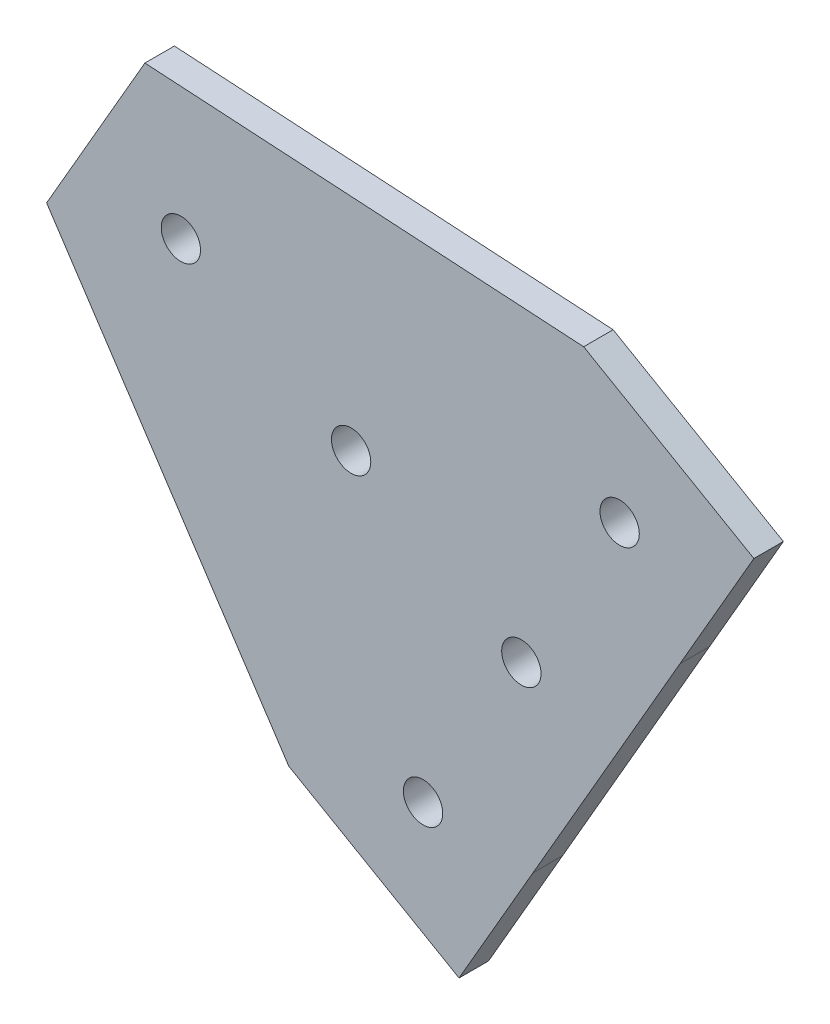
ISO-10303-21;
HEADER;
FILE_DESCRIPTION(('STEP AP214'),'2;1');
FILE_NAME('part.step','',(''),(''),'','','');
FILE_SCHEMA(('AUTOMOTIVE_DESIGN { 1 0 10303 214 1 1 1 1 }'));
ENDSEC;
DATA;
#1=APPLICATION_CONTEXT('core data for automotive mechanical design processes');
#2=APPLICATION_PROTOCOL_DEFINITION('international standard','automotive_design',2000,#1);
#3=PRODUCT_CONTEXT('',#1,'mechanical');
#4=PRODUCT('Part','Part','',(#3));
#5=PRODUCT_RELATED_PRODUCT_CATEGORY('part','',(#4));
#6=PRODUCT_DEFINITION_FORMATION('','',#4);
#7=PRODUCT_DEFINITION_CONTEXT('part definition',#1,'design');
#8=PRODUCT_DEFINITION('design','',#6,#7);
#9=PRODUCT_DEFINITION_SHAPE('','',#8);
#10=(LENGTH_UNIT() NAMED_UNIT(*) SI_UNIT(.MILLI.,.METRE.));
#11=(NAMED_UNIT(*) PLANE_ANGLE_UNIT() SI_UNIT($,.RADIAN.));
#12=(NAMED_UNIT(*) SI_UNIT($,.STERADIAN.) SOLID_ANGLE_UNIT());
#13=UNCERTAINTY_MEASURE_WITH_UNIT(LENGTH_MEASURE(1.E-05),#10,'distance_accuracy_value','');
#14=(GEOMETRIC_REPRESENTATION_CONTEXT(3) GLOBAL_UNCERTAINTY_ASSIGNED_CONTEXT((#13)) GLOBAL_UNIT_ASSIGNED_CONTEXT((#10,
#11,#12)) REPRESENTATION_CONTEXT('',''));
#15=CARTESIAN_POINT('',(0.,0.,0.));
#16=DIRECTION('',(0.,0.,1.));
#17=DIRECTION('',(1.,0.,0.));
#18=AXIS2_PLACEMENT_3D('',#15,#16,#17);
#19=CARTESIAN_POINT('',(18.546417841305,-9.55966834000055,3.));
#20=DIRECTION('',(0.,0.,1.));
#21=DIRECTION('',(1.,0.,0.));
#22=AXIS2_PLACEMENT_3D('',#19,#20,#21);
#23=PLANE('',#22);
#24=CARTESIAN_POINT('',(23.0560367845379,28.2512207924548,3.));
#25=DIRECTION('',(0.,0.,1.));
#26=DIRECTION('',(1.,0.,0.));
#27=AXIS2_PLACEMENT_3D('',#24,#25,#26);
#28=CIRCLE('',#27,2.);
#29=CARTESIAN_POINT('',(25.0560367845379,28.2512207924548,3.));
#30=VERTEX_POINT('',#29);
#31=EDGE_CURVE('E271',#30,#30,#28,.T.);
#32=ORIENTED_EDGE('',*,*,#31,.F.);
#33=EDGE_LOOP('',(#32));
#34=FACE_BOUND('',#33,.T.);
#35=CARTESIAN_POINT('',(3.05603678453836,-6.38979535892303,3.));
#36=DIRECTION('',(0.,0.,1.));
#37=DIRECTION('',(1.,0.,0.));
#38=AXIS2_PLACEMENT_3D('',#35,#36,#37);
#39=CIRCLE('',#38,2.);
#40=CARTESIAN_POINT('',(5.05603678453836,-6.38979535892303,3.));
#41=VERTEX_POINT('',#40);
#42=EDGE_CURVE('E255',#41,#41,#39,.T.);
#43=ORIENTED_EDGE('',*,*,#42,.F.);
#44=EDGE_LOOP('',(#43));
#45=FACE_BOUND('',#44,.T.);
#46=CARTESIAN_POINT('',(18.546417841305,-9.55966834000055,3.));
#47=DIRECTION('',(0.,0.,-1.));
#48=DIRECTION('',(1.,0.,0.));
#49=AXIS2_PLACEMENT_3D('',#46,#47,#48);
#50=CIRCLE('',#49,5.00000000000003);
#51=CARTESIAN_POINT('',(14.2162908223827,-7.0596683400006,3.));
#52=VERTEX_POINT('',#51);
#53=CARTESIAN_POINT('',(14.2635690539358,-6.97951209191583,3.));
#54=VERTEX_POINT('',#53);
#55=EDGE_CURVE('E188',#52,#54,#50,.T.);
#56=ORIENTED_EDGE('',*,*,#55,.T.);
#57=DIRECTION('',(0.500000000000001,0.866025403784438,0.));
#58=VECTOR('',#57,1.);
#59=CARTESIAN_POINT('',(14.2635690539358,-6.97951209191583,3.));
#60=LINE('',#59,#58);
#61=CARTESIAN_POINT('',(29.1705125910356,18.8400714999014,3.));
#62=VERTEX_POINT('',#61);
#63=EDGE_CURVE('E112',#54,#62,#60,.T.);
#64=ORIENTED_EDGE('',*,*,#63,.T.);
#65=CARTESIAN_POINT('',(33.5464178413046,16.4210937735327,3.));
#66=DIRECTION('',(0.,0.,-1.));
#67=DIRECTION('',(1.,0.,0.));
#68=AXIS2_PLACEMENT_3D('',#65,#66,#67);
#69=CIRCLE('',#68,4.99999999999999);
#70=CARTESIAN_POINT('',(29.2162908223824,18.9210937735327,3.));
#71=VERTEX_POINT('',#70);
#72=EDGE_CURVE('E217',#62,#71,#69,.T.);
#73=ORIENTED_EDGE('',*,*,#72,.T.);
#74=DIRECTION('',(0.499999999999984,0.866025403784448,0.));
#75=VECTOR('',#74,1.);
#76=CARTESIAN_POINT('',(29.2162908223824,18.9210937735327,3.));
#77=LINE('',#76,#75);
#78=CARTESIAN_POINT('',(36.7162908223822,31.9114748302994,3.));
#79=VERTEX_POINT('',#78);
#80=EDGE_CURVE('E237',#71,#79,#77,.T.);
#81=ORIENTED_EDGE('',*,*,#80,.T.);
#82=DIRECTION('',(-0.866025403784447,0.499999999999985,0.));
#83=VECTOR('',#82,1.);
#84=CARTESIAN_POINT('',(36.7162908223822,31.9114748302994,3.));
#85=LINE('',#84,#83);
#86=CARTESIAN_POINT('',(19.3957827466933,41.9114748302991,3.));
#87=VERTEX_POINT('',#86);
#88=EDGE_CURVE('E233',#79,#87,#85,.T.);
#89=ORIENTED_EDGE('',*,*,#88,.T.);
#90=DIRECTION('',(-0.998203466991463,0.0599152608792024,0.));
#91=VECTOR('',#90,1.);
#92=CARTESIAN_POINT('',(19.3957827466933,41.9114748302991,3.));
#93=LINE('',#92,#91);
#94=CARTESIAN_POINT('',(-25.2452334046843,44.5909667546097,3.));
#95=VERTEX_POINT('',#94);
#96=EDGE_CURVE('E236',#87,#95,#93,.T.);
#97=ORIENTED_EDGE('',*,*,#96,.T.);
#98=DIRECTION('',(-0.49999999999999,-0.866025403784444,0.));
#99=VECTOR('',#98,1.);
#100=CARTESIAN_POINT('',(-25.2452334046843,44.5909667546097,3.));
#101=LINE('',#100,#99);
#102=CARTESIAN_POINT('',(-35.2452334046841,27.2704586789209,3.));
#103=VERTEX_POINT('',#102);
#104=EDGE_CURVE('E137',#95,#103,#101,.T.);
#105=ORIENTED_EDGE('',*,*,#104,.T.);
#106=DIRECTION('',(0.550989871491516,-0.834511930120692,0.));
#107=VECTOR('',#106,1.);
#108=CARTESIAN_POINT('',(-35.2452334046841,27.2704586789209,3.));
#109=LINE('',#108,#107);
#110=CARTESIAN_POINT('',(-10.604217253306,-10.0500493967676,3.));
#111=VERTEX_POINT('',#110);
#112=EDGE_CURVE('E131',#103,#111,#109,.T.);
#113=ORIENTED_EDGE('',*,*,#112,.T.);
#114=DIRECTION('',(0.866025403784445,-0.499999999999989,0.));
#115=VECTOR('',#114,1.);
#116=CARTESIAN_POINT('',(-10.604217253306,-10.0500493967676,3.));
#117=LINE('',#116,#115);
#118=CARTESIAN_POINT('',(6.71629082238295,-20.0500493967674,3.));
#119=VERTEX_POINT('',#118);
#120=EDGE_CURVE('E135',#111,#119,#117,.T.);
#121=ORIENTED_EDGE('',*,*,#120,.T.);
#122=DIRECTION('',(0.499999999999984,0.866025403784448,0.));
#123=VECTOR('',#122,1.);
#124=CARTESIAN_POINT('',(6.71629082238295,-20.0500493967674,3.));
#125=LINE('',#124,#123);
#126=EDGE_CURVE('E63',#119,#52,#125,.T.);
#127=ORIENTED_EDGE('',*,*,#126,.T.);
#128=EDGE_LOOP('',(#56,#64,#73,#81,#89,#97,#105,#113,#121,#127));
#129=FACE_BOUND('',#128,.T.);
#130=CARTESIAN_POINT('',(-21.5849793668397,30.9307127167654,3.));
#131=DIRECTION('',(0.,0.,1.));
#132=DIRECTION('',(1.,0.,0.));
#133=AXIS2_PLACEMENT_3D('',#130,#131,#132);
#134=CIRCLE('',#133,2.);
#135=CARTESIAN_POINT('',(-19.5849793668397,30.9307127167654,3.));
#136=VERTEX_POINT('',#135);
#137=EDGE_CURVE('E164',#136,#136,#134,.T.);
#138=ORIENTED_EDGE('',*,*,#137,.F.);
#139=EDGE_LOOP('',(#138));
#140=FACE_BOUND('',#139,.T.);
#141=CARTESIAN_POINT('',(13.0560367845381,10.9307127167659,3.));
#142=DIRECTION('',(0.,0.,1.));
#143=DIRECTION('',(1.,0.,0.));
#144=AXIS2_PLACEMENT_3D('',#141,#142,#143);
#145=CIRCLE('',#144,2.);
#146=CARTESIAN_POINT('',(15.0560367845381,10.9307127167659,3.));
#147=VERTEX_POINT('',#146);
#148=EDGE_CURVE('E263',#147,#147,#145,.T.);
#149=ORIENTED_EDGE('',*,*,#148,.F.);
#150=EDGE_LOOP('',(#149));
#151=FACE_BOUND('',#150,.T.);
#152=CARTESIAN_POINT('',(-4.26447129115082,20.9307127167657,3.));
#153=DIRECTION('',(0.,0.,1.));
#154=DIRECTION('',(1.,0.,0.));
#155=AXIS2_PLACEMENT_3D('',#152,#153,#154);
#156=CIRCLE('',#155,2.);
#157=CARTESIAN_POINT('',(-2.26447129115082,20.9307127167657,3.));
#158=VERTEX_POINT('',#157);
#159=EDGE_CURVE('E279',#158,#158,#156,.T.);
#160=ORIENTED_EDGE('',*,*,#159,.F.);
#161=EDGE_LOOP('',(#160));
#162=FACE_BOUND('',#161,.T.);
#163=ADVANCED_FACE('F45',(#34,#45,#129,#140,#151,#162),#23,.T.);
#164=CARTESIAN_POINT('',(18.546417841305,-9.55966834000055,0.));
#165=DIRECTION('',(0.,0.,1.));
#166=DIRECTION('',(1.,0.,0.));
#167=AXIS2_PLACEMENT_3D('',#164,#165,#166);
#168=PLANE('',#167);
#169=CARTESIAN_POINT('',(18.546417841305,-9.55966834000055,0.));
#170=DIRECTION('',(0.,0.,-1.));
#171=DIRECTION('',(1.,0.,0.));
#172=AXIS2_PLACEMENT_3D('',#169,#170,#171);
#173=CIRCLE('',#172,5.00000000000003);
#174=CARTESIAN_POINT('',(14.2162908223827,-7.0596683400006,0.));
#175=VERTEX_POINT('',#174);
#176=CARTESIAN_POINT('',(14.2635690539358,-6.97951209191583,0.));
#177=VERTEX_POINT('',#176);
#178=EDGE_CURVE('E159',#175,#177,#173,.T.);
#179=ORIENTED_EDGE('',*,*,#178,.F.);
#180=DIRECTION('',(0.499999999999984,0.866025403784448,0.));
#181=VECTOR('',#180,1.);
#182=CARTESIAN_POINT('',(6.71629082238295,-20.0500493967674,0.));
#183=LINE('',#182,#181);
#184=CARTESIAN_POINT('',(6.71629082238295,-20.0500493967674,0.));
#185=VERTEX_POINT('',#184);
#186=EDGE_CURVE('E104',#185,#175,#183,.T.);
#187=ORIENTED_EDGE('',*,*,#186,.F.);
#188=DIRECTION('',(0.866025403784445,-0.499999999999989,0.));
#189=VECTOR('',#188,1.);
#190=CARTESIAN_POINT('',(-10.604217253306,-10.0500493967676,0.));
#191=LINE('',#190,#189);
#192=CARTESIAN_POINT('',(-10.604217253306,-10.0500493967676,0.));
#193=VERTEX_POINT('',#192);
#194=EDGE_CURVE('E98',#193,#185,#191,.T.);
#195=ORIENTED_EDGE('',*,*,#194,.F.);
#196=DIRECTION('',(0.550989871491516,-0.834511930120692,0.));
#197=VECTOR('',#196,1.);
#198=CARTESIAN_POINT('',(-35.2452334046841,27.2704586789209,0.));
#199=LINE('',#198,#197);
#200=CARTESIAN_POINT('',(-35.2452334046841,27.2704586789209,0.));
#201=VERTEX_POINT('',#200);
#202=EDGE_CURVE('E146',#201,#193,#199,.T.);
#203=ORIENTED_EDGE('',*,*,#202,.F.);
#204=DIRECTION('',(-0.49999999999999,-0.866025403784444,0.));
#205=VECTOR('',#204,1.);
#206=CARTESIAN_POINT('',(-25.2452334046843,44.5909667546097,0.));
#207=LINE('',#206,#205);
#208=CARTESIAN_POINT('',(-25.2452334046843,44.5909667546097,0.));
#209=VERTEX_POINT('',#208);
#210=EDGE_CURVE('E179',#209,#201,#207,.T.);
#211=ORIENTED_EDGE('',*,*,#210,.F.);
#212=DIRECTION('',(-0.998203466991463,0.0599152608792024,0.));
#213=VECTOR('',#212,1.);
#214=CARTESIAN_POINT('',(19.3957827466933,41.9114748302991,0.));
#215=LINE('',#214,#213);
#216=CARTESIAN_POINT('',(19.3957827466933,41.9114748302991,0.));
#217=VERTEX_POINT('',#216);
#218=EDGE_CURVE('E176',#217,#209,#215,.T.);
#219=ORIENTED_EDGE('',*,*,#218,.F.);
#220=DIRECTION('',(-0.866025403784447,0.499999999999985,0.));
#221=VECTOR('',#220,1.);
#222=CARTESIAN_POINT('',(36.7162908223822,31.9114748302994,0.));
#223=LINE('',#222,#221);
#224=CARTESIAN_POINT('',(36.7162908223822,31.9114748302994,0.));
#225=VERTEX_POINT('',#224);
#226=EDGE_CURVE('E173',#225,#217,#223,.T.);
#227=ORIENTED_EDGE('',*,*,#226,.F.);
#228=DIRECTION('',(0.499999999999984,0.866025403784448,0.));
#229=VECTOR('',#228,1.);
#230=CARTESIAN_POINT('',(29.2162908223824,18.9210937735327,0.));
#231=LINE('',#230,#229);
#232=CARTESIAN_POINT('',(29.2162908223824,18.9210937735327,0.));
#233=VERTEX_POINT('',#232);
#234=EDGE_CURVE('E170',#233,#225,#231,.T.);
#235=ORIENTED_EDGE('',*,*,#234,.F.);
#236=CARTESIAN_POINT('',(33.5464178413046,16.4210937735327,0.));
#237=DIRECTION('',(0.,0.,-1.));
#238=DIRECTION('',(1.,0.,0.));
#239=AXIS2_PLACEMENT_3D('',#236,#237,#238);
#240=CIRCLE('',#239,4.99999999999999);
#241=CARTESIAN_POINT('',(29.1705125910356,18.8400714999014,0.));
#242=VERTEX_POINT('',#241);
#243=EDGE_CURVE('E167',#242,#233,#240,.T.);
#244=ORIENTED_EDGE('',*,*,#243,.F.);
#245=DIRECTION('',(0.500000000000001,0.866025403784438,0.));
#246=VECTOR('',#245,1.);
#247=CARTESIAN_POINT('',(14.2635690539358,-6.97951209191583,0.));
#248=LINE('',#247,#246);
#249=EDGE_CURVE('E163',#177,#242,#248,.T.);
#250=ORIENTED_EDGE('',*,*,#249,.F.);
#251=EDGE_LOOP('',(#179,#187,#195,#203,#211,#219,#227,#235,#244,#250));
#252=FACE_BOUND('',#251,.T.);
#253=CARTESIAN_POINT('',(-21.5849793668397,30.9307127167654,0.));
#254=DIRECTION('',(0.,0.,1.));
#255=DIRECTION('',(1.,0.,0.));
#256=AXIS2_PLACEMENT_3D('',#253,#254,#255);
#257=CIRCLE('',#256,2.);
#258=CARTESIAN_POINT('',(-19.5849793668397,30.9307127167654,0.));
#259=VERTEX_POINT('',#258);
#260=EDGE_CURVE('E251',#259,#259,#257,.T.);
#261=ORIENTED_EDGE('',*,*,#260,.T.);
#262=EDGE_LOOP('',(#261));
#263=FACE_BOUND('',#262,.T.);
#264=CARTESIAN_POINT('',(3.05603678453836,-6.38979535892303,0.));
#265=DIRECTION('',(0.,0.,1.));
#266=DIRECTION('',(1.,0.,0.));
#267=AXIS2_PLACEMENT_3D('',#264,#265,#266);
#268=CIRCLE('',#267,2.);
#269=CARTESIAN_POINT('',(5.05603678453836,-6.38979535892303,0.));
#270=VERTEX_POINT('',#269);
#271=EDGE_CURVE('E259',#270,#270,#268,.T.);
#272=ORIENTED_EDGE('',*,*,#271,.T.);
#273=EDGE_LOOP('',(#272));
#274=FACE_BOUND('',#273,.T.);
#275=CARTESIAN_POINT('',(13.0560367845381,10.9307127167659,0.));
#276=DIRECTION('',(0.,0.,1.));
#277=DIRECTION('',(1.,0.,0.));
#278=AXIS2_PLACEMENT_3D('',#275,#276,#277);
#279=CIRCLE('',#278,2.);
#280=CARTESIAN_POINT('',(15.0560367845381,10.9307127167659,0.));
#281=VERTEX_POINT('',#280);
#282=EDGE_CURVE('E267',#281,#281,#279,.T.);
#283=ORIENTED_EDGE('',*,*,#282,.T.);
#284=EDGE_LOOP('',(#283));
#285=FACE_BOUND('',#284,.T.);
#286=CARTESIAN_POINT('',(23.0560367845379,28.2512207924548,0.));
#287=DIRECTION('',(0.,0.,1.));
#288=DIRECTION('',(1.,0.,0.));
#289=AXIS2_PLACEMENT_3D('',#286,#287,#288);
#290=CIRCLE('',#289,2.);
#291=CARTESIAN_POINT('',(25.0560367845379,28.2512207924548,0.));
#292=VERTEX_POINT('',#291);
#293=EDGE_CURVE('E275',#292,#292,#290,.T.);
#294=ORIENTED_EDGE('',*,*,#293,.T.);
#295=EDGE_LOOP('',(#294));
#296=FACE_BOUND('',#295,.T.);
#297=CARTESIAN_POINT('',(-4.26447129115082,20.9307127167657,0.));
#298=DIRECTION('',(0.,0.,1.));
#299=DIRECTION('',(1.,0.,0.));
#300=AXIS2_PLACEMENT_3D('',#297,#298,#299);
#301=CIRCLE('',#300,2.);
#302=CARTESIAN_POINT('',(-2.26447129115082,20.9307127167657,0.));
#303=VERTEX_POINT('',#302);
#304=EDGE_CURVE('E283',#303,#303,#301,.T.);
#305=ORIENTED_EDGE('',*,*,#304,.T.);
#306=EDGE_LOOP('',(#305));
#307=FACE_BOUND('',#306,.T.);
#308=ADVANCED_FACE('F221',(#252,#263,#274,#285,#296,#307),#168,.F.);
#309=CARTESIAN_POINT('',(18.546417841305,-9.55966834000055,3.));
#310=DIRECTION('',(0.,0.,-1.));
#311=DIRECTION('',(-1.,0.,0.));
#312=AXIS2_PLACEMENT_3D('',#309,#310,#311);
#313=CYLINDRICAL_SURFACE('',#312,5.00000000000003);
#314=ORIENTED_EDGE('',*,*,#178,.T.);
#315=DIRECTION('',(0.,0.,-1.));
#316=VECTOR('',#315,1.);
#317=CARTESIAN_POINT('',(14.2635690539358,-6.97951209191583,3.));
#318=LINE('',#317,#316);
#319=EDGE_CURVE('E11',#54,#177,#318,.T.);
#320=ORIENTED_EDGE('',*,*,#319,.F.);
#321=ORIENTED_EDGE('',*,*,#55,.F.);
#322=DIRECTION('',(0.,0.,-1.));
#323=VECTOR('',#322,1.);
#324=CARTESIAN_POINT('',(14.2162908223827,-7.0596683400006,3.));
#325=LINE('',#324,#323);
#326=EDGE_CURVE('E155',#52,#175,#325,.T.);
#327=ORIENTED_EDGE('',*,*,#326,.T.);
#328=EDGE_LOOP('',(#314,#320,#321,#327));
#329=FACE_BOUND('',#328,.T.);
#330=ADVANCED_FACE('F47',(#329),#313,.F.);
#331=CARTESIAN_POINT('',(14.2635690539358,-6.97951209191583,3.));
#332=DIRECTION('',(-0.866025403784438,0.500000000000001,0.));
#333=DIRECTION('',(-0.500000000000001,-0.866025403784438,0.));
#334=AXIS2_PLACEMENT_3D('',#331,#332,#333);
#335=PLANE('',#334);
#336=ORIENTED_EDGE('',*,*,#249,.T.);
#337=DIRECTION('',(0.,0.,-1.));
#338=VECTOR('',#337,1.);
#339=CARTESIAN_POINT('',(29.1705125910356,18.8400714999014,3.));
#340=LINE('',#339,#338);
#341=EDGE_CURVE('E55',#62,#242,#340,.T.);
#342=ORIENTED_EDGE('',*,*,#341,.F.);
#343=ORIENTED_EDGE('',*,*,#63,.F.);
#344=ORIENTED_EDGE('',*,*,#319,.T.);
#345=EDGE_LOOP('',(#336,#342,#343,#344));
#346=FACE_BOUND('',#345,.T.);
#347=ADVANCED_FACE('F327',(#346),#335,.F.);
#348=CARTESIAN_POINT('',(33.5464178413046,16.4210937735327,3.));
#349=DIRECTION('',(0.,0.,-1.));
#350=DIRECTION('',(-1.,0.,0.));
#351=AXIS2_PLACEMENT_3D('',#348,#349,#350);
#352=CYLINDRICAL_SURFACE('',#351,4.99999999999999);
#353=ORIENTED_EDGE('',*,*,#243,.T.);
#354=DIRECTION('',(0.,0.,-1.));
#355=VECTOR('',#354,1.);
#356=CARTESIAN_POINT('',(29.2162908223824,18.9210937735327,3.));
#357=LINE('',#356,#355);
#358=EDGE_CURVE('E207',#71,#233,#357,.T.);
#359=ORIENTED_EDGE('',*,*,#358,.F.);
#360=ORIENTED_EDGE('',*,*,#72,.F.);
#361=ORIENTED_EDGE('',*,*,#341,.T.);
#362=EDGE_LOOP('',(#353,#359,#360,#361));
#363=FACE_BOUND('',#362,.T.);
#364=ADVANCED_FACE('F215',(#363),#352,.F.);
#365=CARTESIAN_POINT('',(29.2162908223824,18.9210937735327,3.));
#366=DIRECTION('',(-0.866025403784448,0.499999999999984,0.));
#367=DIRECTION('',(-0.499999999999984,-0.866025403784448,0.));
#368=AXIS2_PLACEMENT_3D('',#365,#366,#367);
#369=PLANE('',#368);
#370=ORIENTED_EDGE('',*,*,#234,.T.);
#371=DIRECTION('',(0.,0.,-1.));
#372=VECTOR('',#371,1.);
#373=CARTESIAN_POINT('',(36.7162908223822,31.9114748302994,3.));
#374=LINE('',#373,#372);
#375=EDGE_CURVE('E203',#79,#225,#374,.T.);
#376=ORIENTED_EDGE('',*,*,#375,.F.);
#377=ORIENTED_EDGE('',*,*,#80,.F.);
#378=ORIENTED_EDGE('',*,*,#358,.T.);
#379=EDGE_LOOP('',(#370,#376,#377,#378));
#380=FACE_BOUND('',#379,.T.);
#381=ADVANCED_FACE('F227',(#380),#369,.F.);
#382=CARTESIAN_POINT('',(36.7162908223822,31.9114748302994,3.));
#383=DIRECTION('',(-0.499999999999985,-0.866025403784447,0.));
#384=DIRECTION('',(0.866025403784448,-0.499999999999985,0.));
#385=AXIS2_PLACEMENT_3D('',#382,#383,#384);
#386=PLANE('',#385);
#387=ORIENTED_EDGE('',*,*,#226,.T.);
#388=DIRECTION('',(0.,0.,-1.));
#389=VECTOR('',#388,1.);
#390=CARTESIAN_POINT('',(19.3957827466933,41.9114748302991,3.));
#391=LINE('',#390,#389);
#392=EDGE_CURVE('E199',#87,#217,#391,.T.);
#393=ORIENTED_EDGE('',*,*,#392,.F.);
#394=ORIENTED_EDGE('',*,*,#88,.F.);
#395=ORIENTED_EDGE('',*,*,#375,.T.);
#396=EDGE_LOOP('',(#387,#393,#394,#395));
#397=FACE_BOUND('',#396,.T.);
#398=ADVANCED_FACE('F231',(#397),#386,.F.);
#399=CARTESIAN_POINT('',(19.3957827466933,41.9114748302991,3.));
#400=DIRECTION('',(-0.0599152608792024,-0.998203466991463,0.));
#401=DIRECTION('',(0.998203466991463,-0.0599152608792024,0.));
#402=AXIS2_PLACEMENT_3D('',#399,#400,#401);
#403=PLANE('',#402);
#404=ORIENTED_EDGE('',*,*,#218,.T.);
#405=DIRECTION('',(0.,0.,-1.));
#406=VECTOR('',#405,1.);
#407=CARTESIAN_POINT('',(-25.2452334046843,44.5909667546097,3.));
#408=LINE('',#407,#406);
#409=EDGE_CURVE('E195',#95,#209,#408,.T.);
#410=ORIENTED_EDGE('',*,*,#409,.F.);
#411=ORIENTED_EDGE('',*,*,#96,.F.);
#412=ORIENTED_EDGE('',*,*,#392,.T.);
#413=EDGE_LOOP('',(#404,#410,#411,#412));
#414=FACE_BOUND('',#413,.T.);
#415=ADVANCED_FACE('F317',(#414),#403,.F.);
#416=CARTESIAN_POINT('',(-25.2452334046843,44.5909667546097,3.));
#417=DIRECTION('',(0.866025403784444,-0.49999999999999,0.));
#418=DIRECTION('',(0.49999999999999,0.866025403784444,0.));
#419=AXIS2_PLACEMENT_3D('',#416,#417,#418);
#420=PLANE('',#419);
#421=ORIENTED_EDGE('',*,*,#210,.T.);
#422=DIRECTION('',(0.,0.,-1.));
#423=VECTOR('',#422,1.);
#424=CARTESIAN_POINT('',(-35.2452334046841,27.2704586789209,3.));
#425=LINE('',#424,#423);
#426=EDGE_CURVE('E148',#103,#201,#425,.T.);
#427=ORIENTED_EDGE('',*,*,#426,.F.);
#428=ORIENTED_EDGE('',*,*,#104,.F.);
#429=ORIENTED_EDGE('',*,*,#409,.T.);
#430=EDGE_LOOP('',(#421,#427,#428,#429));
#431=FACE_BOUND('',#430,.T.);
#432=ADVANCED_FACE('F314',(#431),#420,.F.);
#433=CARTESIAN_POINT('',(-35.2452334046841,27.2704586789209,3.));
#434=DIRECTION('',(0.834511930120691,0.550989871491516,0.));
#435=DIRECTION('',(-0.550989871491516,0.834511930120692,0.));
#436=AXIS2_PLACEMENT_3D('',#433,#434,#435);
#437=PLANE('',#436);
#438=ORIENTED_EDGE('',*,*,#202,.T.);
#439=DIRECTION('',(0.,0.,-1.));
#440=VECTOR('',#439,1.);
#441=CARTESIAN_POINT('',(-10.604217253306,-10.0500493967676,3.));
#442=LINE('',#441,#440);
#443=EDGE_CURVE('E143',#111,#193,#442,.T.);
#444=ORIENTED_EDGE('',*,*,#443,.F.);
#445=ORIENTED_EDGE('',*,*,#112,.F.);
#446=ORIENTED_EDGE('',*,*,#426,.T.);
#447=EDGE_LOOP('',(#438,#444,#445,#446));
#448=FACE_BOUND('',#447,.T.);
#449=ADVANCED_FACE('F144',(#448),#437,.F.);
#450=CARTESIAN_POINT('',(-10.604217253306,-10.0500493967676,3.));
#451=DIRECTION('',(0.499999999999989,0.866025403784445,0.));
#452=DIRECTION('',(-0.866025403784445,0.499999999999989,0.));
#453=AXIS2_PLACEMENT_3D('',#450,#451,#452);
#454=PLANE('',#453);
#455=ORIENTED_EDGE('',*,*,#194,.T.);
#456=DIRECTION('',(0.,0.,-1.));
#457=VECTOR('',#456,1.);
#458=CARTESIAN_POINT('',(6.71629082238295,-20.0500493967674,3.));
#459=LINE('',#458,#457);
#460=EDGE_CURVE('E149',#119,#185,#459,.T.);
#461=ORIENTED_EDGE('',*,*,#460,.F.);
#462=ORIENTED_EDGE('',*,*,#120,.F.);
#463=ORIENTED_EDGE('',*,*,#443,.T.);
#464=EDGE_LOOP('',(#455,#461,#462,#463));
#465=FACE_BOUND('',#464,.T.);
#466=ADVANCED_FACE('F151',(#465),#454,.F.);
#467=CARTESIAN_POINT('',(6.71629082238295,-20.0500493967674,3.));
#468=DIRECTION('',(-0.866025403784448,0.499999999999984,0.));
#469=DIRECTION('',(-0.499999999999984,-0.866025403784448,0.));
#470=AXIS2_PLACEMENT_3D('',#467,#468,#469);
#471=PLANE('',#470);
#472=ORIENTED_EDGE('',*,*,#186,.T.);
#473=ORIENTED_EDGE('',*,*,#326,.F.);
#474=ORIENTED_EDGE('',*,*,#126,.F.);
#475=ORIENTED_EDGE('',*,*,#460,.T.);
#476=EDGE_LOOP('',(#472,#473,#474,#475));
#477=FACE_BOUND('',#476,.T.);
#478=ADVANCED_FACE('F307',(#477),#471,.F.);
#479=CARTESIAN_POINT('',(-21.5849793668397,30.9307127167654,3.));
#480=DIRECTION('',(0.,0.,-1.));
#481=DIRECTION('',(-1.,0.,0.));
#482=AXIS2_PLACEMENT_3D('',#479,#480,#481);
#483=CYLINDRICAL_SURFACE('',#482,2.);
#484=ORIENTED_EDGE('',*,*,#137,.T.);
#485=EDGE_LOOP('',(#484));
#486=FACE_BOUND('',#485,.T.);
#487=ORIENTED_EDGE('',*,*,#260,.F.);
#488=EDGE_LOOP('',(#487));
#489=FACE_BOUND('',#488,.T.);
#490=ADVANCED_FACE('F304',(#486,#489),#483,.F.);
#491=CARTESIAN_POINT('',(3.05603678453836,-6.38979535892303,3.));
#492=DIRECTION('',(0.,0.,-1.));
#493=DIRECTION('',(-1.,0.,0.));
#494=AXIS2_PLACEMENT_3D('',#491,#492,#493);
#495=CYLINDRICAL_SURFACE('',#494,2.);
#496=ORIENTED_EDGE('',*,*,#42,.T.);
#497=EDGE_LOOP('',(#496));
#498=FACE_BOUND('',#497,.T.);
#499=ORIENTED_EDGE('',*,*,#271,.F.);
#500=EDGE_LOOP('',(#499));
#501=FACE_BOUND('',#500,.T.);
#502=ADVANCED_FACE('F402',(#498,#501),#495,.F.);
#503=CARTESIAN_POINT('',(13.0560367845381,10.9307127167659,3.));
#504=DIRECTION('',(0.,0.,-1.));
#505=DIRECTION('',(-1.,0.,0.));
#506=AXIS2_PLACEMENT_3D('',#503,#504,#505);
#507=CYLINDRICAL_SURFACE('',#506,2.);
#508=ORIENTED_EDGE('',*,*,#148,.T.);
#509=EDGE_LOOP('',(#508));
#510=FACE_BOUND('',#509,.T.);
#511=ORIENTED_EDGE('',*,*,#282,.F.);
#512=EDGE_LOOP('',(#511));
#513=FACE_BOUND('',#512,.T.);
#514=ADVANCED_FACE('F410',(#510,#513),#507,.F.);
#515=CARTESIAN_POINT('',(23.0560367845379,28.2512207924548,3.));
#516=DIRECTION('',(0.,0.,-1.));
#517=DIRECTION('',(-1.,0.,0.));
#518=AXIS2_PLACEMENT_3D('',#515,#516,#517);
#519=CYLINDRICAL_SURFACE('',#518,2.);
#520=ORIENTED_EDGE('',*,*,#31,.T.);
#521=EDGE_LOOP('',(#520));
#522=FACE_BOUND('',#521,.T.);
#523=ORIENTED_EDGE('',*,*,#293,.F.);
#524=EDGE_LOOP('',(#523));
#525=FACE_BOUND('',#524,.T.);
#526=ADVANCED_FACE('F418',(#522,#525),#519,.F.);
#527=CARTESIAN_POINT('',(-4.26447129115082,20.9307127167657,3.));
#528=DIRECTION('',(0.,0.,-1.));
#529=DIRECTION('',(-1.,0.,0.));
#530=AXIS2_PLACEMENT_3D('',#527,#528,#529);
#531=CYLINDRICAL_SURFACE('',#530,2.);
#532=ORIENTED_EDGE('',*,*,#159,.T.);
#533=EDGE_LOOP('',(#532));
#534=FACE_BOUND('',#533,.T.);
#535=ORIENTED_EDGE('',*,*,#304,.F.);
#536=EDGE_LOOP('',(#535));
#537=FACE_BOUND('',#536,.T.);
#538=ADVANCED_FACE('F291',(#534,#537),#531,.F.);
#539=CLOSED_SHELL('',(#163,#308,#330,#347,#364,#381,#398,#415,#432,#449,#466,#478,#490,#502,
#514,#526,#538));
#540=MANIFOLD_SOLID_BREP('B2',#539);
#541=ADVANCED_BREP_SHAPE_REPRESENTATION('',(#18,#540),#14);
#542=SHAPE_DEFINITION_REPRESENTATION(#9,#541);
ENDSEC;
END-ISO-10303-21;
